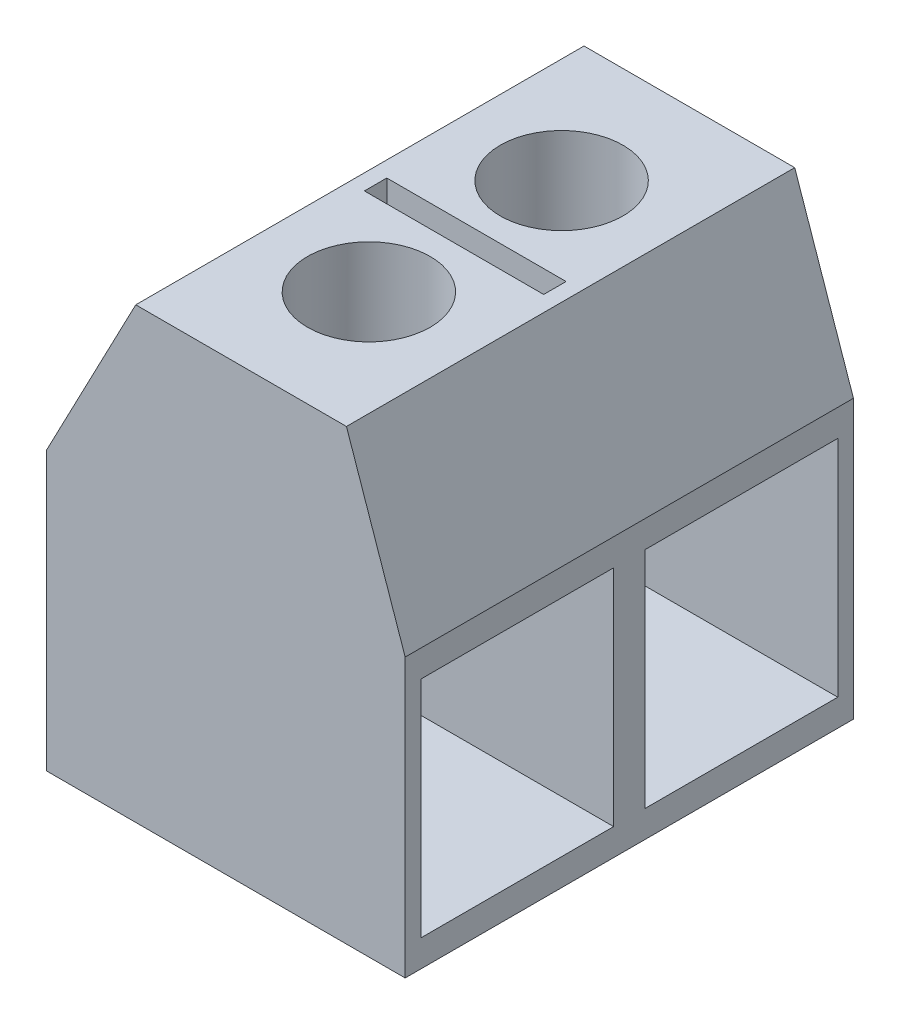
ISO-10303-21;
HEADER;
FILE_DESCRIPTION(('STEP AP214'),'2;1');
FILE_NAME('part.step','',(''),(''),'','','');
FILE_SCHEMA(('AUTOMOTIVE_DESIGN { 1 0 10303 214 1 1 1 1 }'));
ENDSEC;
DATA;
#1=APPLICATION_CONTEXT('core data for automotive mechanical design processes');
#2=APPLICATION_PROTOCOL_DEFINITION('international standard','automotive_design',2000,#1);
#3=PRODUCT_CONTEXT('',#1,'mechanical');
#4=PRODUCT('Part','Part','',(#3));
#5=PRODUCT_RELATED_PRODUCT_CATEGORY('part','',(#4));
#6=PRODUCT_DEFINITION_FORMATION('','',#4);
#7=PRODUCT_DEFINITION_CONTEXT('part definition',#1,'design');
#8=PRODUCT_DEFINITION('design','',#6,#7);
#9=PRODUCT_DEFINITION_SHAPE('','',#8);
#10=(LENGTH_UNIT() NAMED_UNIT(*) SI_UNIT(.MILLI.,.METRE.));
#11=(NAMED_UNIT(*) PLANE_ANGLE_UNIT() SI_UNIT($,.RADIAN.));
#12=(NAMED_UNIT(*) SI_UNIT($,.STERADIAN.) SOLID_ANGLE_UNIT());
#13=UNCERTAINTY_MEASURE_WITH_UNIT(LENGTH_MEASURE(1.E-05),#10,'distance_accuracy_value','');
#14=(GEOMETRIC_REPRESENTATION_CONTEXT(3) GLOBAL_UNCERTAINTY_ASSIGNED_CONTEXT((#13)) GLOBAL_UNIT_ASSIGNED_CONTEXT((#10,
#11,#12)) REPRESENTATION_CONTEXT('',''));
#15=CARTESIAN_POINT('',(0.,0.,0.));
#16=DIRECTION('',(0.,0.,1.));
#17=DIRECTION('',(1.,0.,0.));
#18=AXIS2_PLACEMENT_3D('',#15,#16,#17);
#19=CARTESIAN_POINT('',(-3.41522048364154,6.2,10.));
#20=DIRECTION('',(1.,0.,0.));
#21=DIRECTION('',(0.,1.,0.));
#22=AXIS2_PLACEMENT_3D('',#19,#20,#21);
#23=PLANE('',#22);
#24=DIRECTION('',(0.,-1.,0.));
#25=VECTOR('',#24,1.);
#26=CARTESIAN_POINT('',(-3.41522048364154,6.2,0.));
#27=LINE('',#26,#25);
#28=CARTESIAN_POINT('',(-3.41522048364154,6.2,0.));
#29=VERTEX_POINT('',#28);
#30=CARTESIAN_POINT('',(-3.41522048364153,0.,0.));
#31=VERTEX_POINT('',#30);
#32=EDGE_CURVE('E270',#29,#31,#27,.T.);
#33=ORIENTED_EDGE('',*,*,#32,.T.);
#34=DIRECTION('',(0.,0.,-1.));
#35=VECTOR('',#34,1.);
#36=CARTESIAN_POINT('',(-3.41522048364153,0.,10.));
#37=LINE('',#36,#35);
#38=CARTESIAN_POINT('',(-3.41522048364153,0.,10.));
#39=VERTEX_POINT('',#38);
#40=EDGE_CURVE('E11',#39,#31,#37,.T.);
#41=ORIENTED_EDGE('',*,*,#40,.F.);
#42=DIRECTION('',(0.,-1.,0.));
#43=VECTOR('',#42,1.);
#44=CARTESIAN_POINT('',(-3.41522048364154,6.2,10.));
#45=LINE('',#44,#43);
#46=CARTESIAN_POINT('',(-3.41522048364154,6.2,10.));
#47=VERTEX_POINT('',#46);
#48=EDGE_CURVE('E321',#47,#39,#45,.T.);
#49=ORIENTED_EDGE('',*,*,#48,.F.);
#50=DIRECTION('',(0.,0.,-1.));
#51=VECTOR('',#50,1.);
#52=CARTESIAN_POINT('',(-3.41522048364154,6.2,10.));
#53=LINE('',#52,#51);
#54=EDGE_CURVE('E341',#47,#29,#53,.T.);
#55=ORIENTED_EDGE('',*,*,#54,.T.);
#56=EDGE_LOOP('',(#33,#41,#49,#55));
#57=FACE_BOUND('',#56,.T.);
#58=ADVANCED_FACE('F51',(#57),#23,.F.);
#59=CARTESIAN_POINT('',(-3.41522048364153,0.,10.));
#60=DIRECTION('',(0.,1.,0.));
#61=DIRECTION('',(0.,0.,1.));
#62=AXIS2_PLACEMENT_3D('',#59,#60,#61);
#63=PLANE('',#62);
#64=DIRECTION('',(1.,0.,0.));
#65=VECTOR('',#64,1.);
#66=CARTESIAN_POINT('',(-3.41522048364153,0.,0.));
#67=LINE('',#66,#65);
#68=CARTESIAN_POINT('',(4.58477951635847,0.,0.));
#69=VERTEX_POINT('',#68);
#70=EDGE_CURVE('E345',#31,#69,#67,.T.);
#71=ORIENTED_EDGE('',*,*,#70,.T.);
#72=DIRECTION('',(0.,0.,-1.));
#73=VECTOR('',#72,1.);
#74=CARTESIAN_POINT('',(4.58477951635847,0.,10.));
#75=LINE('',#74,#73);
#76=CARTESIAN_POINT('',(4.58477951635847,0.,10.));
#77=VERTEX_POINT('',#76);
#78=EDGE_CURVE('E60',#77,#69,#75,.T.);
#79=ORIENTED_EDGE('',*,*,#78,.F.);
#80=DIRECTION('',(1.,0.,0.));
#81=VECTOR('',#80,1.);
#82=CARTESIAN_POINT('',(-3.41522048364153,0.,10.));
#83=LINE('',#82,#81);
#84=EDGE_CURVE('E325',#39,#77,#83,.T.);
#85=ORIENTED_EDGE('',*,*,#84,.F.);
#86=ORIENTED_EDGE('',*,*,#40,.T.);
#87=EDGE_LOOP('',(#71,#79,#85,#86));
#88=FACE_BOUND('',#87,.T.);
#89=ADVANCED_FACE('F403',(#88),#63,.F.);
#90=CARTESIAN_POINT('',(4.58477951635847,0.,10.));
#91=DIRECTION('',(-1.,0.,0.));
#92=DIRECTION('',(0.,0.,1.));
#93=AXIS2_PLACEMENT_3D('',#90,#91,#92);
#94=PLANE('',#93);
#95=DIRECTION('',(0.,0.,1.));
#96=VECTOR('',#95,1.);
#97=CARTESIAN_POINT('',(4.58477951635847,5.6,4.65));
#98=LINE('',#97,#96);
#99=CARTESIAN_POINT('',(4.58477951635847,5.6,0.35));
#100=VERTEX_POINT('',#99);
#101=CARTESIAN_POINT('',(4.58477951635847,5.6,4.65));
#102=VERTEX_POINT('',#101);
#103=EDGE_CURVE('E255',#100,#102,#98,.T.);
#104=ORIENTED_EDGE('',*,*,#103,.F.);
#105=DIRECTION('',(0.,1.,0.));
#106=VECTOR('',#105,1.);
#107=CARTESIAN_POINT('',(4.58477951635847,0.599999999999999,0.350000000000001));
#108=LINE('',#107,#106);
#109=CARTESIAN_POINT('',(4.58477951635847,0.599999999999999,0.350000000000001));
#110=VERTEX_POINT('',#109);
#111=EDGE_CURVE('E76',#110,#100,#108,.T.);
#112=ORIENTED_EDGE('',*,*,#111,.F.);
#113=DIRECTION('',(0.,0.,-1.));
#114=VECTOR('',#113,1.);
#115=CARTESIAN_POINT('',(4.58477951635847,0.599999999999999,4.65));
#116=LINE('',#115,#114);
#117=CARTESIAN_POINT('',(4.58477951635847,0.599999999999999,4.65));
#118=VERTEX_POINT('',#117);
#119=EDGE_CURVE('E240',#118,#110,#116,.T.);
#120=ORIENTED_EDGE('',*,*,#119,.F.);
#121=DIRECTION('',(0.,-1.,0.));
#122=VECTOR('',#121,1.);
#123=CARTESIAN_POINT('',(4.58477951635847,0.599999999999999,4.65));
#124=LINE('',#123,#122);
#125=EDGE_CURVE('E260',#102,#118,#124,.T.);
#126=ORIENTED_EDGE('',*,*,#125,.F.);
#127=EDGE_LOOP('',(#104,#112,#120,#126));
#128=FACE_BOUND('',#127,.T.);
#129=DIRECTION('',(0.,0.,1.));
#130=VECTOR('',#129,1.);
#131=CARTESIAN_POINT('',(4.58477951635847,5.6,5.35));
#132=LINE('',#131,#130);
#133=CARTESIAN_POINT('',(4.58477951635847,5.6,5.35));
#134=VERTEX_POINT('',#133);
#135=CARTESIAN_POINT('',(4.58477951635847,5.6,9.65));
#136=VERTEX_POINT('',#135);
#137=EDGE_CURVE('E300',#134,#136,#132,.T.);
#138=ORIENTED_EDGE('',*,*,#137,.F.);
#139=DIRECTION('',(0.,1.,0.));
#140=VECTOR('',#139,1.);
#141=CARTESIAN_POINT('',(4.58477951635847,0.600000000000002,5.35));
#142=LINE('',#141,#140);
#143=CARTESIAN_POINT('',(4.58477951635847,0.600000000000002,5.35));
#144=VERTEX_POINT('',#143);
#145=EDGE_CURVE('E297',#144,#134,#142,.T.);
#146=ORIENTED_EDGE('',*,*,#145,.F.);
#147=DIRECTION('',(0.,0.,-1.));
#148=VECTOR('',#147,1.);
#149=CARTESIAN_POINT('',(4.58477951635847,0.600000000000002,5.35));
#150=LINE('',#149,#148);
#151=CARTESIAN_POINT('',(4.58477951635847,0.600000000000002,9.65));
#152=VERTEX_POINT('',#151);
#153=EDGE_CURVE('E284',#152,#144,#150,.T.);
#154=ORIENTED_EDGE('',*,*,#153,.F.);
#155=DIRECTION('',(0.,-1.,0.));
#156=VECTOR('',#155,1.);
#157=CARTESIAN_POINT('',(4.58477951635847,0.600000000000002,9.65));
#158=LINE('',#157,#156);
#159=EDGE_CURVE('E304',#136,#152,#158,.T.);
#160=ORIENTED_EDGE('',*,*,#159,.F.);
#161=EDGE_LOOP('',(#138,#146,#154,#160));
#162=FACE_BOUND('',#161,.T.);
#163=DIRECTION('',(0.,1.,0.));
#164=VECTOR('',#163,1.);
#165=CARTESIAN_POINT('',(4.58477951635847,0.,0.));
#166=LINE('',#165,#164);
#167=CARTESIAN_POINT('',(4.58477951635847,6.2,0.));
#168=VERTEX_POINT('',#167);
#169=EDGE_CURVE('E348',#69,#168,#166,.T.);
#170=ORIENTED_EDGE('',*,*,#169,.T.);
#171=DIRECTION('',(0.,0.,-1.));
#172=VECTOR('',#171,1.);
#173=CARTESIAN_POINT('',(4.58477951635847,6.2,10.));
#174=LINE('',#173,#172);
#175=CARTESIAN_POINT('',(4.58477951635847,6.2,10.));
#176=VERTEX_POINT('',#175);
#177=EDGE_CURVE('E369',#176,#168,#174,.T.);
#178=ORIENTED_EDGE('',*,*,#177,.F.);
#179=DIRECTION('',(0.,1.,0.));
#180=VECTOR('',#179,1.);
#181=CARTESIAN_POINT('',(4.58477951635847,0.,10.));
#182=LINE('',#181,#180);
#183=EDGE_CURVE('E329',#77,#176,#182,.T.);
#184=ORIENTED_EDGE('',*,*,#183,.F.);
#185=ORIENTED_EDGE('',*,*,#78,.T.);
#186=EDGE_LOOP('',(#170,#178,#184,#185));
#187=FACE_BOUND('',#186,.T.);
#188=ADVANCED_FACE('F408',(#128,#162,#187),#94,.F.);
#189=CARTESIAN_POINT('',(4.58477951635847,6.2,10.));
#190=DIRECTION('',(-0.945410467545081,-0.325881953867028,0.));
#191=DIRECTION('',(0.325881953867028,-0.945410467545081,0.));
#192=AXIS2_PLACEMENT_3D('',#189,#190,#191);
#193=PLANE('',#192);
#194=DIRECTION('',(-0.325881953867028,0.945410467545081,0.));
#195=VECTOR('',#194,1.);
#196=CARTESIAN_POINT('',(4.58477951635847,6.2,0.));
#197=LINE('',#196,#195);
#198=CARTESIAN_POINT('',(3.27473406181301,10.0005500795312,0.));
#199=VERTEX_POINT('',#198);
#200=EDGE_CURVE('E351',#168,#199,#197,.T.);
#201=ORIENTED_EDGE('',*,*,#200,.T.);
#202=DIRECTION('',(0.,0.,-1.));
#203=VECTOR('',#202,1.);
#204=CARTESIAN_POINT('',(3.27473406181301,10.0005500795312,10.));
#205=LINE('',#204,#203);
#206=CARTESIAN_POINT('',(3.27473406181301,10.0005500795312,10.));
#207=VERTEX_POINT('',#206);
#208=EDGE_CURVE('E365',#207,#199,#205,.T.);
#209=ORIENTED_EDGE('',*,*,#208,.F.);
#210=DIRECTION('',(-0.325881953867028,0.945410467545081,0.));
#211=VECTOR('',#210,1.);
#212=CARTESIAN_POINT('',(4.58477951635847,6.2,10.));
#213=LINE('',#212,#211);
#214=EDGE_CURVE('E332',#176,#207,#213,.T.);
#215=ORIENTED_EDGE('',*,*,#214,.F.);
#216=ORIENTED_EDGE('',*,*,#177,.T.);
#217=EDGE_LOOP('',(#201,#209,#215,#216));
#218=FACE_BOUND('',#217,.T.);
#219=ADVANCED_FACE('F433',(#218),#193,.F.);
#220=CARTESIAN_POINT('',(3.27473406181301,10.0005500795312,10.));
#221=DIRECTION('',(0.,-1.,0.));
#222=DIRECTION('',(1.,0.,0.));
#223=AXIS2_PLACEMENT_3D('',#220,#221,#222);
#224=PLANE('',#223);
#225=CARTESIAN_POINT('',(0.924734061813011,10.0005500795312,7.15));
#226=DIRECTION('',(0.,1.,0.));
#227=DIRECTION('',(1.,0.,0.));
#228=AXIS2_PLACEMENT_3D('',#225,#226,#227);
#229=CIRCLE('',#228,1.36868671342724);
#230=CARTESIAN_POINT('',(2.29342077524025,10.0005500795312,7.15));
#231=VERTEX_POINT('',#230);
#232=EDGE_CURVE('E210',#231,#231,#229,.T.);
#233=ORIENTED_EDGE('',*,*,#232,.F.);
#234=EDGE_LOOP('',(#233));
#235=FACE_BOUND('',#234,.T.);
#236=CARTESIAN_POINT('',(0.924734061813011,10.0005500795312,2.85));
#237=DIRECTION('',(0.,1.,0.));
#238=DIRECTION('',(-1.,0.,0.));
#239=AXIS2_PLACEMENT_3D('',#236,#237,#238);
#240=CIRCLE('',#239,1.36868671342724);
#241=CARTESIAN_POINT('',(-0.443952651614231,10.0005500795312,2.85));
#242=VERTEX_POINT('',#241);
#243=EDGE_CURVE('E220',#242,#242,#240,.T.);
#244=ORIENTED_EDGE('',*,*,#243,.F.);
#245=EDGE_LOOP('',(#244));
#246=FACE_BOUND('',#245,.T.);
#247=DIRECTION('',(1.,0.,0.));
#248=VECTOR('',#247,1.);
#249=CARTESIAN_POINT('',(2.92473406181301,10.0005500795312,5.25));
#250=LINE('',#249,#248);
#251=CARTESIAN_POINT('',(-1.07526593818699,10.0005500795312,5.25));
#252=VERTEX_POINT('',#251);
#253=CARTESIAN_POINT('',(2.92473406181301,10.0005500795312,5.25));
#254=VERTEX_POINT('',#253);
#255=EDGE_CURVE('E219',#252,#254,#250,.T.);
#256=ORIENTED_EDGE('',*,*,#255,.F.);
#257=DIRECTION('',(0.,0.,1.));
#258=VECTOR('',#257,1.);
#259=CARTESIAN_POINT('',(-1.07526593818699,10.0005500795312,5.25));
#260=LINE('',#259,#258);
#261=CARTESIAN_POINT('',(-1.07526593818699,10.0005500795312,4.75));
#262=VERTEX_POINT('',#261);
#263=EDGE_CURVE('E68',#262,#252,#260,.T.);
#264=ORIENTED_EDGE('',*,*,#263,.F.);
#265=DIRECTION('',(-1.,0.,0.));
#266=VECTOR('',#265,1.);
#267=CARTESIAN_POINT('',(2.92473406181301,10.0005500795312,4.75));
#268=LINE('',#267,#266);
#269=CARTESIAN_POINT('',(2.92473406181301,10.0005500795312,4.75));
#270=VERTEX_POINT('',#269);
#271=EDGE_CURVE('E201',#270,#262,#268,.T.);
#272=ORIENTED_EDGE('',*,*,#271,.F.);
#273=DIRECTION('',(0.,0.,-1.));
#274=VECTOR('',#273,1.);
#275=CARTESIAN_POINT('',(2.92473406181301,10.0005500795312,5.25));
#276=LINE('',#275,#274);
#277=EDGE_CURVE('E207',#254,#270,#276,.T.);
#278=ORIENTED_EDGE('',*,*,#277,.F.);
#279=EDGE_LOOP('',(#256,#264,#272,#278));
#280=FACE_BOUND('',#279,.T.);
#281=DIRECTION('',(-1.,0.,0.));
#282=VECTOR('',#281,1.);
#283=CARTESIAN_POINT('',(3.27473406181301,10.0005500795312,0.));
#284=LINE('',#283,#282);
#285=CARTESIAN_POINT('',(-1.42526593818699,10.0005500795312,0.));
#286=VERTEX_POINT('',#285);
#287=EDGE_CURVE('E354',#199,#286,#284,.T.);
#288=ORIENTED_EDGE('',*,*,#287,.T.);
#289=DIRECTION('',(0.,0.,-1.));
#290=VECTOR('',#289,1.);
#291=CARTESIAN_POINT('',(-1.42526593818699,10.0005500795312,10.));
#292=LINE('',#291,#290);
#293=CARTESIAN_POINT('',(-1.42526593818699,10.0005500795312,10.));
#294=VERTEX_POINT('',#293);
#295=EDGE_CURVE('E361',#294,#286,#292,.T.);
#296=ORIENTED_EDGE('',*,*,#295,.F.);
#297=DIRECTION('',(-1.,0.,0.));
#298=VECTOR('',#297,1.);
#299=CARTESIAN_POINT('',(3.27473406181301,10.0005500795312,10.));
#300=LINE('',#299,#298);
#301=EDGE_CURVE('E335',#207,#294,#300,.T.);
#302=ORIENTED_EDGE('',*,*,#301,.F.);
#303=ORIENTED_EDGE('',*,*,#208,.T.);
#304=EDGE_LOOP('',(#288,#296,#302,#303));
#305=FACE_BOUND('',#304,.T.);
#306=ADVANCED_FACE('F430',(#235,#246,#280,#305),#224,.F.);
#307=CARTESIAN_POINT('',(-1.42526593818699,10.0005500795312,10.));
#308=DIRECTION('',(0.885909109447838,-0.463858868404323,0.));
#309=DIRECTION('',(0.463858868404323,0.885909109447838,0.));
#310=AXIS2_PLACEMENT_3D('',#307,#308,#309);
#311=PLANE('',#310);
#312=DIRECTION('',(-0.463858868404323,-0.885909109447838,0.));
#313=VECTOR('',#312,1.);
#314=CARTESIAN_POINT('',(-1.42526593818699,10.0005500795312,0.));
#315=LINE('',#314,#313);
#316=EDGE_CURVE('E326',#286,#29,#315,.T.);
#317=ORIENTED_EDGE('',*,*,#316,.T.);
#318=ORIENTED_EDGE('',*,*,#54,.F.);
#319=DIRECTION('',(-0.463858868404323,-0.885909109447838,0.));
#320=VECTOR('',#319,1.);
#321=CARTESIAN_POINT('',(-1.42526593818699,10.0005500795312,10.));
#322=LINE('',#321,#320);
#323=EDGE_CURVE('E338',#294,#47,#322,.T.);
#324=ORIENTED_EDGE('',*,*,#323,.F.);
#325=ORIENTED_EDGE('',*,*,#295,.T.);
#326=EDGE_LOOP('',(#317,#318,#324,#325));
#327=FACE_BOUND('',#326,.T.);
#328=ADVANCED_FACE('F428',(#327),#311,.F.);
#329=CARTESIAN_POINT('',(0.,0.,10.));
#330=DIRECTION('',(0.,0.,1.));
#331=DIRECTION('',(1.,0.,0.));
#332=AXIS2_PLACEMENT_3D('',#329,#330,#331);
#333=PLANE('',#332);
#334=ORIENTED_EDGE('',*,*,#48,.T.);
#335=ORIENTED_EDGE('',*,*,#84,.T.);
#336=ORIENTED_EDGE('',*,*,#183,.T.);
#337=ORIENTED_EDGE('',*,*,#214,.T.);
#338=ORIENTED_EDGE('',*,*,#301,.T.);
#339=ORIENTED_EDGE('',*,*,#323,.T.);
#340=EDGE_LOOP('',(#334,#335,#336,#337,#338,#339));
#341=FACE_BOUND('',#340,.T.);
#342=ADVANCED_FACE('F423',(#341),#333,.T.);
#343=CARTESIAN_POINT('',(0.,0.,0.));
#344=DIRECTION('',(0.,0.,1.));
#345=DIRECTION('',(1.,0.,0.));
#346=AXIS2_PLACEMENT_3D('',#343,#344,#345);
#347=PLANE('',#346);
#348=ORIENTED_EDGE('',*,*,#32,.F.);
#349=ORIENTED_EDGE('',*,*,#316,.F.);
#350=ORIENTED_EDGE('',*,*,#287,.F.);
#351=ORIENTED_EDGE('',*,*,#200,.F.);
#352=ORIENTED_EDGE('',*,*,#169,.F.);
#353=ORIENTED_EDGE('',*,*,#70,.F.);
#354=EDGE_LOOP('',(#348,#349,#350,#351,#352,#353));
#355=FACE_BOUND('',#354,.T.);
#356=ADVANCED_FACE('F416',(#355),#347,.F.);
#357=CARTESIAN_POINT('',(-0.715220483641534,0.600000000000002,5.35));
#358=DIRECTION('',(0.,0.,-1.));
#359=DIRECTION('',(-1.,0.,0.));
#360=AXIS2_PLACEMENT_3D('',#357,#358,#359);
#361=PLANE('',#360);
#362=ORIENTED_EDGE('',*,*,#145,.T.);
#363=DIRECTION('',(1.,0.,0.));
#364=VECTOR('',#363,1.);
#365=CARTESIAN_POINT('',(-0.715220483641534,5.6,5.35));
#366=LINE('',#365,#364);
#367=CARTESIAN_POINT('',(-0.715220483641534,5.6,5.35));
#368=VERTEX_POINT('',#367);
#369=EDGE_CURVE('E296',#368,#134,#366,.T.);
#370=ORIENTED_EDGE('',*,*,#369,.F.);
#371=DIRECTION('',(0.,1.,0.));
#372=VECTOR('',#371,1.);
#373=CARTESIAN_POINT('',(-0.715220483641534,0.600000000000002,5.35));
#374=LINE('',#373,#372);
#375=CARTESIAN_POINT('',(-0.715220483641534,0.600000000000002,5.35));
#376=VERTEX_POINT('',#375);
#377=EDGE_CURVE('E279',#376,#368,#374,.T.);
#378=ORIENTED_EDGE('',*,*,#377,.F.);
#379=DIRECTION('',(1.,0.,0.));
#380=VECTOR('',#379,1.);
#381=CARTESIAN_POINT('',(-0.715220483641534,0.600000000000002,5.35));
#382=LINE('',#381,#380);
#383=EDGE_CURVE('E256',#376,#144,#382,.T.);
#384=ORIENTED_EDGE('',*,*,#383,.T.);
#385=EDGE_LOOP('',(#362,#370,#378,#384));
#386=FACE_BOUND('',#385,.T.);
#387=ADVANCED_FACE('F454',(#386),#361,.F.);
#388=CARTESIAN_POINT('',(-0.715220483641534,0.600000000000002,5.35));
#389=DIRECTION('',(0.,-1.,0.));
#390=DIRECTION('',(0.,0.,-1.));
#391=AXIS2_PLACEMENT_3D('',#388,#389,#390);
#392=PLANE('',#391);
#393=ORIENTED_EDGE('',*,*,#153,.T.);
#394=ORIENTED_EDGE('',*,*,#383,.F.);
#395=DIRECTION('',(0.,0.,-1.));
#396=VECTOR('',#395,1.);
#397=CARTESIAN_POINT('',(-0.715220483641534,0.600000000000002,5.35));
#398=LINE('',#397,#396);
#399=CARTESIAN_POINT('',(-0.715220483641534,0.600000000000002,9.65));
#400=VERTEX_POINT('',#399);
#401=EDGE_CURVE('E292',#400,#376,#398,.T.);
#402=ORIENTED_EDGE('',*,*,#401,.F.);
#403=DIRECTION('',(1.,0.,0.));
#404=VECTOR('',#403,1.);
#405=CARTESIAN_POINT('',(-0.715220483641534,0.600000000000002,9.65));
#406=LINE('',#405,#404);
#407=EDGE_CURVE('E312',#400,#152,#406,.T.);
#408=ORIENTED_EDGE('',*,*,#407,.T.);
#409=EDGE_LOOP('',(#393,#394,#402,#408));
#410=FACE_BOUND('',#409,.T.);
#411=ADVANCED_FACE('F459',(#410),#392,.F.);
#412=CARTESIAN_POINT('',(-0.715220483641534,0.600000000000002,9.65));
#413=DIRECTION('',(0.,0.,1.));
#414=DIRECTION('',(1.,0.,0.));
#415=AXIS2_PLACEMENT_3D('',#412,#413,#414);
#416=PLANE('',#415);
#417=ORIENTED_EDGE('',*,*,#159,.T.);
#418=ORIENTED_EDGE('',*,*,#407,.F.);
#419=DIRECTION('',(0.,-1.,0.));
#420=VECTOR('',#419,1.);
#421=CARTESIAN_POINT('',(-0.715220483641534,0.600000000000002,9.65));
#422=LINE('',#421,#420);
#423=CARTESIAN_POINT('',(-0.715220483641534,5.6,9.65));
#424=VERTEX_POINT('',#423);
#425=EDGE_CURVE('E288',#424,#400,#422,.T.);
#426=ORIENTED_EDGE('',*,*,#425,.F.);
#427=DIRECTION('',(1.,0.,0.));
#428=VECTOR('',#427,1.);
#429=CARTESIAN_POINT('',(-0.715220483641534,5.6,9.65));
#430=LINE('',#429,#428);
#431=EDGE_CURVE('E315',#424,#136,#430,.T.);
#432=ORIENTED_EDGE('',*,*,#431,.T.);
#433=EDGE_LOOP('',(#417,#418,#426,#432));
#434=FACE_BOUND('',#433,.T.);
#435=ADVANCED_FACE('F464',(#434),#416,.F.);
#436=CARTESIAN_POINT('',(-0.715220483641534,5.6,5.35));
#437=DIRECTION('',(0.,1.,0.));
#438=DIRECTION('',(0.,0.,1.));
#439=AXIS2_PLACEMENT_3D('',#436,#437,#438);
#440=PLANE('',#439);
#441=CARTESIAN_POINT('',(0.924734061813015,5.6,7.15));
#442=DIRECTION('',(0.,1.,0.));
#443=DIRECTION('',(0.,0.,1.));
#444=AXIS2_PLACEMENT_3D('',#441,#442,#443);
#445=CIRCLE('',#444,1.36868671342724);
#446=CARTESIAN_POINT('',(0.924734061813015,5.6,8.51868671342724));
#447=VERTEX_POINT('',#446);
#448=EDGE_CURVE('E54',#447,#447,#445,.T.);
#449=ORIENTED_EDGE('',*,*,#448,.T.);
#450=EDGE_LOOP('',(#449));
#451=FACE_BOUND('',#450,.T.);
#452=ORIENTED_EDGE('',*,*,#137,.T.);
#453=ORIENTED_EDGE('',*,*,#431,.F.);
#454=DIRECTION('',(0.,0.,1.));
#455=VECTOR('',#454,1.);
#456=CARTESIAN_POINT('',(-0.715220483641534,5.6,5.35));
#457=LINE('',#456,#455);
#458=EDGE_CURVE('E283',#368,#424,#457,.T.);
#459=ORIENTED_EDGE('',*,*,#458,.F.);
#460=ORIENTED_EDGE('',*,*,#369,.T.);
#461=EDGE_LOOP('',(#452,#453,#459,#460));
#462=FACE_BOUND('',#461,.T.);
#463=ADVANCED_FACE('F383',(#451,#462),#440,.F.);
#464=CARTESIAN_POINT('',(-0.715220483641534,0.,0.));
#465=DIRECTION('',(1.,0.,0.));
#466=DIRECTION('',(0.,0.,-1.));
#467=AXIS2_PLACEMENT_3D('',#464,#465,#466);
#468=PLANE('',#467);
#469=ORIENTED_EDGE('',*,*,#377,.T.);
#470=ORIENTED_EDGE('',*,*,#458,.T.);
#471=ORIENTED_EDGE('',*,*,#425,.T.);
#472=ORIENTED_EDGE('',*,*,#401,.T.);
#473=EDGE_LOOP('',(#469,#470,#471,#472));
#474=FACE_BOUND('',#473,.T.);
#475=ADVANCED_FACE('F463',(#474),#468,.T.);
#476=CARTESIAN_POINT('',(-0.715220483641534,0.599999999999999,0.350000000000001));
#477=DIRECTION('',(0.,0.,-1.));
#478=DIRECTION('',(-1.,0.,0.));
#479=AXIS2_PLACEMENT_3D('',#476,#477,#478);
#480=PLANE('',#479);
#481=ORIENTED_EDGE('',*,*,#111,.T.);
#482=DIRECTION('',(1.,0.,0.));
#483=VECTOR('',#482,1.);
#484=CARTESIAN_POINT('',(-0.715220483641534,5.6,0.350000000000001));
#485=LINE('',#484,#483);
#486=CARTESIAN_POINT('',(-0.715220483641534,5.6,0.350000000000001));
#487=VERTEX_POINT('',#486);
#488=EDGE_CURVE('E252',#487,#100,#485,.T.);
#489=ORIENTED_EDGE('',*,*,#488,.F.);
#490=DIRECTION('',(0.,1.,0.));
#491=VECTOR('',#490,1.);
#492=CARTESIAN_POINT('',(-0.715220483641534,0.599999999999999,0.350000000000001));
#493=LINE('',#492,#491);
#494=CARTESIAN_POINT('',(-0.715220483641534,0.599999999999999,0.350000000000001));
#495=VERTEX_POINT('',#494);
#496=EDGE_CURVE('E235',#495,#487,#493,.T.);
#497=ORIENTED_EDGE('',*,*,#496,.F.);
#498=DIRECTION('',(1.,0.,0.));
#499=VECTOR('',#498,1.);
#500=CARTESIAN_POINT('',(-0.715220483641534,0.599999999999999,0.350000000000001));
#501=LINE('',#500,#499);
#502=EDGE_CURVE('E267',#495,#110,#501,.T.);
#503=ORIENTED_EDGE('',*,*,#502,.T.);
#504=EDGE_LOOP('',(#481,#489,#497,#503));
#505=FACE_BOUND('',#504,.T.);
#506=ADVANCED_FACE('F473',(#505),#480,.F.);
#507=CARTESIAN_POINT('',(-0.715220483641534,0.599999999999999,4.65));
#508=DIRECTION('',(0.,-1.,0.));
#509=DIRECTION('',(0.,0.,-1.));
#510=AXIS2_PLACEMENT_3D('',#507,#508,#509);
#511=PLANE('',#510);
#512=ORIENTED_EDGE('',*,*,#119,.T.);
#513=ORIENTED_EDGE('',*,*,#502,.F.);
#514=DIRECTION('',(0.,0.,-1.));
#515=VECTOR('',#514,1.);
#516=CARTESIAN_POINT('',(-0.715220483641534,0.599999999999999,4.65));
#517=LINE('',#516,#515);
#518=CARTESIAN_POINT('',(-0.715220483641534,0.599999999999999,4.65));
#519=VERTEX_POINT('',#518);
#520=EDGE_CURVE('E248',#519,#495,#517,.T.);
#521=ORIENTED_EDGE('',*,*,#520,.F.);
#522=DIRECTION('',(1.,0.,0.));
#523=VECTOR('',#522,1.);
#524=CARTESIAN_POINT('',(-0.715220483641534,0.599999999999999,4.65));
#525=LINE('',#524,#523);
#526=EDGE_CURVE('E271',#519,#118,#525,.T.);
#527=ORIENTED_EDGE('',*,*,#526,.T.);
#528=EDGE_LOOP('',(#512,#513,#521,#527));
#529=FACE_BOUND('',#528,.T.);
#530=ADVANCED_FACE('F477',(#529),#511,.F.);
#531=CARTESIAN_POINT('',(-0.715220483641534,0.599999999999999,4.65));
#532=DIRECTION('',(0.,0.,1.));
#533=DIRECTION('',(1.,0.,0.));
#534=AXIS2_PLACEMENT_3D('',#531,#532,#533);
#535=PLANE('',#534);
#536=ORIENTED_EDGE('',*,*,#125,.T.);
#537=ORIENTED_EDGE('',*,*,#526,.F.);
#538=DIRECTION('',(0.,-1.,0.));
#539=VECTOR('',#538,1.);
#540=CARTESIAN_POINT('',(-0.715220483641534,0.599999999999999,4.65));
#541=LINE('',#540,#539);
#542=CARTESIAN_POINT('',(-0.715220483641534,5.6,4.65));
#543=VERTEX_POINT('',#542);
#544=EDGE_CURVE('E244',#543,#519,#541,.T.);
#545=ORIENTED_EDGE('',*,*,#544,.F.);
#546=DIRECTION('',(1.,0.,0.));
#547=VECTOR('',#546,1.);
#548=CARTESIAN_POINT('',(-0.715220483641534,5.6,4.65));
#549=LINE('',#548,#547);
#550=EDGE_CURVE('E274',#543,#102,#549,.T.);
#551=ORIENTED_EDGE('',*,*,#550,.T.);
#552=EDGE_LOOP('',(#536,#537,#545,#551));
#553=FACE_BOUND('',#552,.T.);
#554=ADVANCED_FACE('F481',(#553),#535,.F.);
#555=CARTESIAN_POINT('',(-0.715220483641534,5.6,4.65));
#556=DIRECTION('',(0.,1.,0.));
#557=DIRECTION('',(0.,0.,1.));
#558=AXIS2_PLACEMENT_3D('',#555,#556,#557);
#559=PLANE('',#558);
#560=CARTESIAN_POINT('',(0.924734061813015,5.6,2.85));
#561=DIRECTION('',(0.,1.,0.));
#562=DIRECTION('',(0.,0.,1.));
#563=AXIS2_PLACEMENT_3D('',#560,#561,#562);
#564=CIRCLE('',#563,1.36868671342724);
#565=CARTESIAN_POINT('',(0.924734061813015,5.6,4.21868671342724));
#566=VERTEX_POINT('',#565);
#567=EDGE_CURVE('E229',#566,#566,#564,.T.);
#568=ORIENTED_EDGE('',*,*,#567,.T.);
#569=EDGE_LOOP('',(#568));
#570=FACE_BOUND('',#569,.T.);
#571=ORIENTED_EDGE('',*,*,#103,.T.);
#572=ORIENTED_EDGE('',*,*,#550,.F.);
#573=DIRECTION('',(0.,0.,1.));
#574=VECTOR('',#573,1.);
#575=CARTESIAN_POINT('',(-0.715220483641534,5.6,4.65));
#576=LINE('',#575,#574);
#577=EDGE_CURVE('E239',#487,#543,#576,.T.);
#578=ORIENTED_EDGE('',*,*,#577,.F.);
#579=ORIENTED_EDGE('',*,*,#488,.T.);
#580=EDGE_LOOP('',(#571,#572,#578,#579));
#581=FACE_BOUND('',#580,.T.);
#582=ADVANCED_FACE('F478',(#570,#581),#559,.F.);
#583=CARTESIAN_POINT('',(-0.715220483641534,0.,0.));
#584=DIRECTION('',(-1.,0.,0.));
#585=DIRECTION('',(0.,0.,1.));
#586=AXIS2_PLACEMENT_3D('',#583,#584,#585);
#587=PLANE('',#586);
#588=ORIENTED_EDGE('',*,*,#496,.T.);
#589=ORIENTED_EDGE('',*,*,#577,.T.);
#590=ORIENTED_EDGE('',*,*,#544,.T.);
#591=ORIENTED_EDGE('',*,*,#520,.T.);
#592=EDGE_LOOP('',(#588,#589,#590,#591));
#593=FACE_BOUND('',#592,.T.);
#594=ADVANCED_FACE('F397',(#593),#587,.F.);
#595=CARTESIAN_POINT('',(0.924734061813015,5.00055007953122,2.85));
#596=DIRECTION('',(0.,1.,0.));
#597=DIRECTION('',(-1.,0.,0.));
#598=AXIS2_PLACEMENT_3D('',#595,#596,#597);
#599=CYLINDRICAL_SURFACE('',#598,1.36868671342724);
#600=ORIENTED_EDGE('',*,*,#243,.T.);
#601=EDGE_LOOP('',(#600));
#602=FACE_BOUND('',#601,.T.);
#603=ORIENTED_EDGE('',*,*,#567,.F.);
#604=EDGE_LOOP('',(#603));
#605=FACE_BOUND('',#604,.T.);
#606=ADVANCED_FACE('F388',(#602,#605),#599,.F.);
#607=CARTESIAN_POINT('',(0.924734061813015,5.00055007953122,7.15));
#608=DIRECTION('',(0.,1.,0.));
#609=DIRECTION('',(-1.,0.,0.));
#610=AXIS2_PLACEMENT_3D('',#607,#608,#609);
#611=CYLINDRICAL_SURFACE('',#610,1.36868671342724);
#612=ORIENTED_EDGE('',*,*,#232,.T.);
#613=EDGE_LOOP('',(#612));
#614=FACE_BOUND('',#613,.T.);
#615=ORIENTED_EDGE('',*,*,#448,.F.);
#616=EDGE_LOOP('',(#615));
#617=FACE_BOUND('',#616,.T.);
#618=ADVANCED_FACE('F386',(#614,#617),#611,.F.);
#619=CARTESIAN_POINT('',(-1.07526593818699,5.00055007953122,5.25));
#620=DIRECTION('',(-1.,0.,0.));
#621=DIRECTION('',(0.,-1.,0.));
#622=AXIS2_PLACEMENT_3D('',#619,#620,#621);
#623=PLANE('',#622);
#624=ORIENTED_EDGE('',*,*,#263,.T.);
#625=DIRECTION('',(0.,1.,0.));
#626=VECTOR('',#625,1.);
#627=CARTESIAN_POINT('',(-1.07526593818699,5.00055007953122,5.25));
#628=LINE('',#627,#626);
#629=CARTESIAN_POINT('',(-1.07526593818699,5.00055007953122,5.25));
#630=VERTEX_POINT('',#629);
#631=EDGE_CURVE('E176',#630,#252,#628,.T.);
#632=ORIENTED_EDGE('',*,*,#631,.F.);
#633=DIRECTION('',(0.,0.,1.));
#634=VECTOR('',#633,1.);
#635=CARTESIAN_POINT('',(-1.07526593818699,5.00055007953122,5.25));
#636=LINE('',#635,#634);
#637=CARTESIAN_POINT('',(-1.07526593818699,5.00055007953122,4.75));
#638=VERTEX_POINT('',#637);
#639=EDGE_CURVE('E180',#638,#630,#636,.T.);
#640=ORIENTED_EDGE('',*,*,#639,.F.);
#641=DIRECTION('',(0.,1.,0.));
#642=VECTOR('',#641,1.);
#643=CARTESIAN_POINT('',(-1.07526593818699,5.00055007953122,4.75));
#644=LINE('',#643,#642);
#645=EDGE_CURVE('E226',#638,#262,#644,.T.);
#646=ORIENTED_EDGE('',*,*,#645,.T.);
#647=EDGE_LOOP('',(#624,#632,#640,#646));
#648=FACE_BOUND('',#647,.T.);
#649=ADVANCED_FACE('F178',(#648),#623,.F.);
#650=CARTESIAN_POINT('',(2.92473406181301,5.00055007953123,4.75));
#651=DIRECTION('',(0.,0.,-1.));
#652=DIRECTION('',(-1.,0.,0.));
#653=AXIS2_PLACEMENT_3D('',#650,#651,#652);
#654=PLANE('',#653);
#655=ORIENTED_EDGE('',*,*,#271,.T.);
#656=ORIENTED_EDGE('',*,*,#645,.F.);
#657=DIRECTION('',(-1.,0.,0.));
#658=VECTOR('',#657,1.);
#659=CARTESIAN_POINT('',(2.92473406181301,5.00055007953123,4.75));
#660=LINE('',#659,#658);
#661=CARTESIAN_POINT('',(2.92473406181301,5.00055007953123,4.75));
#662=VERTEX_POINT('',#661);
#663=EDGE_CURVE('E187',#662,#638,#660,.T.);
#664=ORIENTED_EDGE('',*,*,#663,.F.);
#665=DIRECTION('',(0.,1.,0.));
#666=VECTOR('',#665,1.);
#667=CARTESIAN_POINT('',(2.92473406181301,5.00055007953123,4.75));
#668=LINE('',#667,#666);
#669=EDGE_CURVE('E230',#662,#270,#668,.T.);
#670=ORIENTED_EDGE('',*,*,#669,.T.);
#671=EDGE_LOOP('',(#655,#656,#664,#670));
#672=FACE_BOUND('',#671,.T.);
#673=ADVANCED_FACE('F395',(#672),#654,.F.);
#674=CARTESIAN_POINT('',(2.92473406181301,5.00055007953123,5.25));
#675=DIRECTION('',(1.,0.,0.));
#676=DIRECTION('',(0.,1.,0.));
#677=AXIS2_PLACEMENT_3D('',#674,#675,#676);
#678=PLANE('',#677);
#679=ORIENTED_EDGE('',*,*,#277,.T.);
#680=ORIENTED_EDGE('',*,*,#669,.F.);
#681=DIRECTION('',(0.,0.,-1.));
#682=VECTOR('',#681,1.);
#683=CARTESIAN_POINT('',(2.92473406181301,5.00055007953123,5.25));
#684=LINE('',#683,#682);
#685=CARTESIAN_POINT('',(2.92473406181301,5.00055007953123,5.25));
#686=VERTEX_POINT('',#685);
#687=EDGE_CURVE('E196',#686,#662,#684,.T.);
#688=ORIENTED_EDGE('',*,*,#687,.F.);
#689=DIRECTION('',(0.,1.,0.));
#690=VECTOR('',#689,1.);
#691=CARTESIAN_POINT('',(2.92473406181301,5.00055007953123,5.25));
#692=LINE('',#691,#690);
#693=EDGE_CURVE('E186',#686,#254,#692,.T.);
#694=ORIENTED_EDGE('',*,*,#693,.T.);
#695=EDGE_LOOP('',(#679,#680,#688,#694));
#696=FACE_BOUND('',#695,.T.);
#697=ADVANCED_FACE('F493',(#696),#678,.F.);
#698=CARTESIAN_POINT('',(2.92473406181301,5.00055007953123,5.25));
#699=DIRECTION('',(0.,0.,1.));
#700=DIRECTION('',(1.,0.,0.));
#701=AXIS2_PLACEMENT_3D('',#698,#699,#700);
#702=PLANE('',#701);
#703=ORIENTED_EDGE('',*,*,#255,.T.);
#704=ORIENTED_EDGE('',*,*,#693,.F.);
#705=DIRECTION('',(1.,0.,0.));
#706=VECTOR('',#705,1.);
#707=CARTESIAN_POINT('',(2.92473406181301,5.00055007953123,5.25));
#708=LINE('',#707,#706);
#709=EDGE_CURVE('E190',#630,#686,#708,.T.);
#710=ORIENTED_EDGE('',*,*,#709,.F.);
#711=ORIENTED_EDGE('',*,*,#631,.T.);
#712=EDGE_LOOP('',(#703,#704,#710,#711));
#713=FACE_BOUND('',#712,.T.);
#714=ADVANCED_FACE('F191',(#713),#702,.F.);
#715=CARTESIAN_POINT('',(0.,5.00055007953122,0.));
#716=DIRECTION('',(0.,1.,0.));
#717=DIRECTION('',(-1.,0.,0.));
#718=AXIS2_PLACEMENT_3D('',#715,#716,#717);
#719=PLANE('',#718);
#720=ORIENTED_EDGE('',*,*,#639,.T.);
#721=ORIENTED_EDGE('',*,*,#709,.T.);
#722=ORIENTED_EDGE('',*,*,#687,.T.);
#723=ORIENTED_EDGE('',*,*,#663,.T.);
#724=EDGE_LOOP('',(#720,#721,#722,#723));
#725=FACE_BOUND('',#724,.T.);
#726=ADVANCED_FACE('F198',(#725),#719,.T.);
#727=CLOSED_SHELL('',(#58,#89,#188,#219,#306,#328,#342,#356,#387,#411,#435,#463,#475,#506,#530,
#554,#582,#594,#606,#618,#649,#673,#697,#714,#726));
#728=MANIFOLD_SOLID_BREP('B2',#727);
#729=ADVANCED_BREP_SHAPE_REPRESENTATION('',(#18,#728),#14);
#730=SHAPE_DEFINITION_REPRESENTATION(#9,#729);
ENDSEC;
END-ISO-10303-21;
